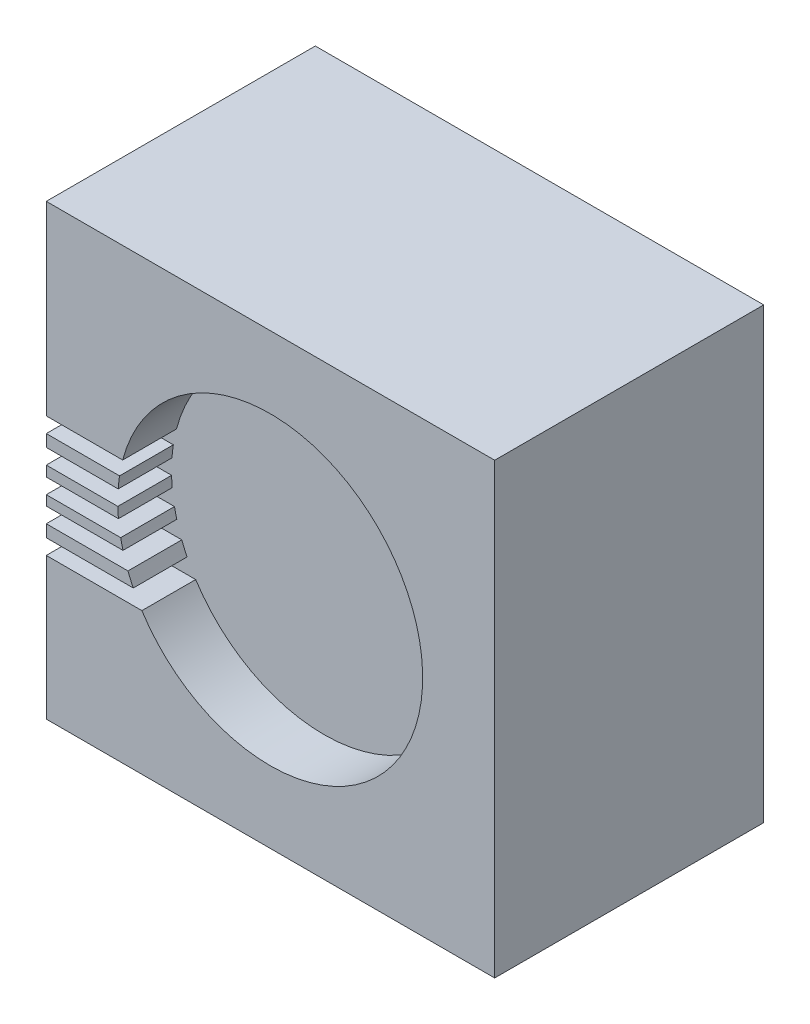
ISO-10303-21;
HEADER;
FILE_DESCRIPTION(('STEP AP214'),'2;1');
FILE_NAME('part.step','',(''),(''),'','','');
FILE_SCHEMA(('AUTOMOTIVE_DESIGN { 1 0 10303 214 1 1 1 1 }'));
ENDSEC;
DATA;
#1=APPLICATION_CONTEXT('core data for automotive mechanical design processes');
#2=APPLICATION_PROTOCOL_DEFINITION('international standard','automotive_design',2000,#1);
#3=PRODUCT_CONTEXT('',#1,'mechanical');
#4=PRODUCT('Part','Part','',(#3));
#5=PRODUCT_RELATED_PRODUCT_CATEGORY('part','',(#4));
#6=PRODUCT_DEFINITION_FORMATION('','',#4);
#7=PRODUCT_DEFINITION_CONTEXT('part definition',#1,'design');
#8=PRODUCT_DEFINITION('design','',#6,#7);
#9=PRODUCT_DEFINITION_SHAPE('','',#8);
#10=(LENGTH_UNIT() NAMED_UNIT(*) SI_UNIT(.MILLI.,.METRE.));
#11=(NAMED_UNIT(*) PLANE_ANGLE_UNIT() SI_UNIT($,.RADIAN.));
#12=(NAMED_UNIT(*) SI_UNIT($,.STERADIAN.) SOLID_ANGLE_UNIT());
#13=UNCERTAINTY_MEASURE_WITH_UNIT(LENGTH_MEASURE(1.E-05),#10,'distance_accuracy_value','');
#14=(GEOMETRIC_REPRESENTATION_CONTEXT(3) GLOBAL_UNCERTAINTY_ASSIGNED_CONTEXT((#13)) GLOBAL_UNIT_ASSIGNED_CONTEXT((#10,
#11,#12)) REPRESENTATION_CONTEXT('',''));
#15=CARTESIAN_POINT('',(0.,0.,0.));
#16=DIRECTION('',(0.,0.,1.));
#17=DIRECTION('',(1.,0.,0.));
#18=AXIS2_PLACEMENT_3D('',#15,#16,#17);
#19=CARTESIAN_POINT('',(-12.4853430800982,12.5073017444322,15.));
#20=DIRECTION('',(1.,0.,0.));
#21=DIRECTION('',(0.,1.,0.));
#22=AXIS2_PLACEMENT_3D('',#19,#20,#21);
#23=PLANE('',#22);
#24=DIRECTION('',(0.,0.,1.));
#25=VECTOR('',#24,1.);
#26=CARTESIAN_POINT('',(-12.4853430800982,1.29501387912612,15.));
#27=LINE('',#26,#25);
#28=CARTESIAN_POINT('',(-12.4853430800982,1.29501387912612,12.));
#29=VERTEX_POINT('',#28);
#30=CARTESIAN_POINT('',(-12.4853430800982,1.29501387912612,15.));
#31=VERTEX_POINT('',#30);
#32=EDGE_CURVE('E397',#29,#31,#27,.T.);
#33=ORIENTED_EDGE('',*,*,#32,.F.);
#34=DIRECTION('',(0.,-1.,0.));
#35=VECTOR('',#34,1.);
#36=CARTESIAN_POINT('',(-12.4853430800982,12.5073017444322,12.));
#37=LINE('',#36,#35);
#38=CARTESIAN_POINT('',(-12.4853430800982,2.14653217976772,12.));
#39=VERTEX_POINT('',#38);
#40=EDGE_CURVE('E12',#39,#29,#37,.T.);
#41=ORIENTED_EDGE('',*,*,#40,.F.);
#42=DIRECTION('',(0.,0.,1.));
#43=VECTOR('',#42,1.);
#44=CARTESIAN_POINT('',(-12.4853430800982,2.14653217976772,15.));
#45=LINE('',#44,#43);
#46=CARTESIAN_POINT('',(-12.4853430800982,2.14653217976772,15.));
#47=VERTEX_POINT('',#46);
#48=EDGE_CURVE('E304',#39,#47,#45,.T.);
#49=ORIENTED_EDGE('',*,*,#48,.T.);
#50=DIRECTION('',(0.,-1.,0.));
#51=VECTOR('',#50,1.);
#52=CARTESIAN_POINT('',(-12.4853430800982,12.5073017444322,15.));
#53=LINE('',#52,#51);
#54=CARTESIAN_POINT('',(-12.4853430800982,12.5073017444322,15.));
#55=VERTEX_POINT('',#54);
#56=EDGE_CURVE('E400',#55,#47,#53,.T.);
#57=ORIENTED_EDGE('',*,*,#56,.F.);
#58=DIRECTION('',(0.,0.,-1.));
#59=VECTOR('',#58,1.);
#60=CARTESIAN_POINT('',(-12.4853430800982,12.5073017444322,15.));
#61=LINE('',#60,#59);
#62=CARTESIAN_POINT('',(-12.4853430800982,12.5073017444322,0.));
#63=VERTEX_POINT('',#62);
#64=EDGE_CURVE('E408',#55,#63,#61,.T.);
#65=ORIENTED_EDGE('',*,*,#64,.T.);
#66=DIRECTION('',(0.,-1.,0.));
#67=VECTOR('',#66,1.);
#68=CARTESIAN_POINT('',(-12.4853430800982,12.5073017444322,0.));
#69=LINE('',#68,#67);
#70=CARTESIAN_POINT('',(-12.4853430800982,-12.4926982555678,0.));
#71=VERTEX_POINT('',#70);
#72=EDGE_CURVE('E399',#63,#71,#69,.T.);
#73=ORIENTED_EDGE('',*,*,#72,.T.);
#74=DIRECTION('',(0.,0.,-1.));
#75=VECTOR('',#74,1.);
#76=CARTESIAN_POINT('',(-12.4853430800982,-12.4926982555678,15.));
#77=LINE('',#76,#75);
#78=CARTESIAN_POINT('',(-12.4853430800982,-12.4926982555678,15.));
#79=VERTEX_POINT('',#78);
#80=EDGE_CURVE('E421',#79,#71,#77,.T.);
#81=ORIENTED_EDGE('',*,*,#80,.F.);
#82=CARTESIAN_POINT('',(-12.4853430800982,-4.58856910952185,15.));
#83=VERTEX_POINT('',#82);
#84=EDGE_CURVE('E160',#83,#79,#53,.T.);
#85=ORIENTED_EDGE('',*,*,#84,.F.);
#86=DIRECTION('',(0.,0.,1.));
#87=VECTOR('',#86,1.);
#88=CARTESIAN_POINT('',(-12.4853430800982,-4.58856910952185,15.));
#89=LINE('',#88,#87);
#90=CARTESIAN_POINT('',(-12.4853430800982,-4.58856910952185,12.));
#91=VERTEX_POINT('',#90);
#92=EDGE_CURVE('E379',#91,#83,#89,.T.);
#93=ORIENTED_EDGE('',*,*,#92,.F.);
#94=CARTESIAN_POINT('',(-12.4853430800982,-3.73705080888024,12.));
#95=VERTEX_POINT('',#94);
#96=EDGE_CURVE('E425',#95,#91,#37,.T.);
#97=ORIENTED_EDGE('',*,*,#96,.F.);
#98=DIRECTION('',(0.,0.,1.));
#99=VECTOR('',#98,1.);
#100=CARTESIAN_POINT('',(-12.4853430800982,-3.73705080888024,15.));
#101=LINE('',#100,#99);
#102=CARTESIAN_POINT('',(-12.4853430800982,-3.73705080888024,15.));
#103=VERTEX_POINT('',#102);
#104=EDGE_CURVE('E393',#95,#103,#101,.T.);
#105=ORIENTED_EDGE('',*,*,#104,.T.);
#106=CARTESIAN_POINT('',(-12.4853430800982,-3.05958451151475,15.));
#107=VERTEX_POINT('',#106);
#108=EDGE_CURVE('E444',#107,#103,#53,.T.);
#109=ORIENTED_EDGE('',*,*,#108,.F.);
#110=DIRECTION('',(0.,0.,1.));
#111=VECTOR('',#110,1.);
#112=CARTESIAN_POINT('',(-12.4853430800982,-3.05958451151475,15.));
#113=LINE('',#112,#111);
#114=CARTESIAN_POINT('',(-12.4853430800982,-3.05958451151475,12.));
#115=VERTEX_POINT('',#114);
#116=EDGE_CURVE('E391',#115,#107,#113,.T.);
#117=ORIENTED_EDGE('',*,*,#116,.F.);
#118=CARTESIAN_POINT('',(-12.4853430800982,-2.20806621087314,12.));
#119=VERTEX_POINT('',#118);
#120=EDGE_CURVE('E116',#119,#115,#37,.T.);
#121=ORIENTED_EDGE('',*,*,#120,.F.);
#122=DIRECTION('',(0.,0.,1.));
#123=VECTOR('',#122,1.);
#124=CARTESIAN_POINT('',(-12.4853430800982,-2.20806621087314,15.));
#125=LINE('',#124,#123);
#126=CARTESIAN_POINT('',(-12.4853430800982,-2.20806621087314,15.));
#127=VERTEX_POINT('',#126);
#128=EDGE_CURVE('E388',#119,#127,#125,.T.);
#129=ORIENTED_EDGE('',*,*,#128,.T.);
#130=CARTESIAN_POINT('',(-12.4853430800982,-1.65595407232962,15.));
#131=VERTEX_POINT('',#130);
#132=EDGE_CURVE('E447',#131,#127,#53,.T.);
#133=ORIENTED_EDGE('',*,*,#132,.F.);
#134=DIRECTION('',(0.,0.,1.));
#135=VECTOR('',#134,1.);
#136=CARTESIAN_POINT('',(-12.4853430800982,-1.65595407232962,15.));
#137=LINE('',#136,#135);
#138=CARTESIAN_POINT('',(-12.4853430800982,-1.65595407232962,12.));
#139=VERTEX_POINT('',#138);
#140=EDGE_CURVE('E386',#139,#131,#137,.T.);
#141=ORIENTED_EDGE('',*,*,#140,.F.);
#142=CARTESIAN_POINT('',(-12.4853430800982,-0.804435771688016,12.));
#143=VERTEX_POINT('',#142);
#144=EDGE_CURVE('E428',#143,#139,#37,.T.);
#145=ORIENTED_EDGE('',*,*,#144,.F.);
#146=DIRECTION('',(0.,0.,1.));
#147=VECTOR('',#146,1.);
#148=CARTESIAN_POINT('',(-12.4853430800982,-0.804435771688016,15.));
#149=LINE('',#148,#147);
#150=CARTESIAN_POINT('',(-12.4853430800982,-0.804435771688016,15.));
#151=VERTEX_POINT('',#150);
#152=EDGE_CURVE('E383',#143,#151,#149,.T.);
#153=ORIENTED_EDGE('',*,*,#152,.T.);
#154=CARTESIAN_POINT('',(-12.4853430800982,-0.226580522162923,15.));
#155=VERTEX_POINT('',#154);
#156=EDGE_CURVE('E449',#155,#151,#53,.T.);
#157=ORIENTED_EDGE('',*,*,#156,.F.);
#158=DIRECTION('',(0.,0.,1.));
#159=VECTOR('',#158,1.);
#160=CARTESIAN_POINT('',(-12.4853430800982,-0.226580522162923,15.));
#161=LINE('',#160,#159);
#162=CARTESIAN_POINT('',(-12.4853430800982,-0.226580522162923,12.));
#163=VERTEX_POINT('',#162);
#164=EDGE_CURVE('E381',#163,#155,#161,.T.);
#165=ORIENTED_EDGE('',*,*,#164,.F.);
#166=CARTESIAN_POINT('',(-12.4853430800982,0.624937778478685,12.));
#167=VERTEX_POINT('',#166);
#168=EDGE_CURVE('E111',#167,#163,#37,.T.);
#169=ORIENTED_EDGE('',*,*,#168,.F.);
#170=DIRECTION('',(0.,0.,1.));
#171=VECTOR('',#170,1.);
#172=CARTESIAN_POINT('',(-12.4853430800982,0.624937778478685,15.));
#173=LINE('',#172,#171);
#174=CARTESIAN_POINT('',(-12.4853430800982,0.624937778478685,15.));
#175=VERTEX_POINT('',#174);
#176=EDGE_CURVE('E376',#167,#175,#173,.T.);
#177=ORIENTED_EDGE('',*,*,#176,.T.);
#178=EDGE_CURVE('E403',#31,#175,#53,.T.);
#179=ORIENTED_EDGE('',*,*,#178,.F.);
#180=EDGE_LOOP('',(#33,#41,#49,#57,#65,#73,#81,#85,#93,#97,#105,#109,#117,#121,#129,#133,#141,
#145,#153,#157,#165,#169,#177,#179));
#181=FACE_BOUND('',#180,.T.);
#182=ADVANCED_FACE('F108',(#181),#23,.F.);
#183=CARTESIAN_POINT('',(0.,0.,15.));
#184=DIRECTION('',(0.,0.,1.));
#185=DIRECTION('',(1.,0.,0.));
#186=AXIS2_PLACEMENT_3D('',#183,#184,#185);
#187=PLANE('',#186);
#188=DIRECTION('',(-1.,0.,0.));
#189=VECTOR('',#188,1.);
#190=CARTESIAN_POINT('',(-8.22449996055819,2.14653217976772,15.));
#191=LINE('',#190,#189);
#192=CARTESIAN_POINT('',(-8.22449996055819,2.14653217976772,15.));
#193=VERTEX_POINT('',#192);
#194=EDGE_CURVE('E308',#193,#47,#191,.T.);
#195=ORIENTED_EDGE('',*,*,#194,.F.);
#196=CARTESIAN_POINT('',(0.,0.,15.));
#197=DIRECTION('',(0.,0.,1.));
#198=DIRECTION('',(1.,0.,0.));
#199=AXIS2_PLACEMENT_3D('',#196,#197,#198);
#200=CIRCLE('',#199,8.5);
#201=CARTESIAN_POINT('',(-7.15507047674178,-4.58856910952185,15.));
#202=VERTEX_POINT('',#201);
#203=EDGE_CURVE('E284',#202,#193,#200,.T.);
#204=ORIENTED_EDGE('',*,*,#203,.F.);
#205=DIRECTION('',(-1.,0.,0.));
#206=VECTOR('',#205,1.);
#207=CARTESIAN_POINT('',(-7.10762675444698,-4.58856910952185,15.));
#208=LINE('',#207,#206);
#209=EDGE_CURVE('E355',#202,#83,#208,.T.);
#210=ORIENTED_EDGE('',*,*,#209,.T.);
#211=ORIENTED_EDGE('',*,*,#84,.T.);
#212=DIRECTION('',(1.,0.,0.));
#213=VECTOR('',#212,1.);
#214=CARTESIAN_POINT('',(-12.4853430800982,-12.4926982555678,15.));
#215=LINE('',#214,#213);
#216=CARTESIAN_POINT('',(12.5146569199018,-12.4926982555678,15.));
#217=VERTEX_POINT('',#216);
#218=EDGE_CURVE('E402',#79,#217,#215,.T.);
#219=ORIENTED_EDGE('',*,*,#218,.T.);
#220=DIRECTION('',(0.,1.,0.));
#221=VECTOR('',#220,1.);
#222=CARTESIAN_POINT('',(12.5146569199018,12.5073017444322,15.));
#223=LINE('',#222,#221);
#224=CARTESIAN_POINT('',(12.5146569199018,12.5073017444322,15.));
#225=VERTEX_POINT('',#224);
#226=EDGE_CURVE('E405',#217,#225,#223,.T.);
#227=ORIENTED_EDGE('',*,*,#226,.T.);
#228=DIRECTION('',(-1.,0.,0.));
#229=VECTOR('',#228,1.);
#230=CARTESIAN_POINT('',(-12.4853430800982,12.5073017444322,15.));
#231=LINE('',#230,#229);
#232=EDGE_CURVE('E132',#225,#55,#231,.T.);
#233=ORIENTED_EDGE('',*,*,#232,.T.);
#234=ORIENTED_EDGE('',*,*,#56,.T.);
#235=EDGE_LOOP('',(#195,#204,#210,#211,#219,#227,#233,#234));
#236=FACE_BOUND('',#235,.T.);
#237=ADVANCED_FACE('F491',(#236),#187,.T.);
#238=DIRECTION('',(-1.,0.,0.));
#239=VECTOR('',#238,1.);
#240=CARTESIAN_POINT('',(-7.10762675444698,-3.73705080888024,15.));
#241=LINE('',#240,#239);
#242=CARTESIAN_POINT('',(-7.63442540417074,-3.73705080888024,15.));
#243=VERTEX_POINT('',#242);
#244=EDGE_CURVE('E298',#243,#103,#241,.T.);
#245=ORIENTED_EDGE('',*,*,#244,.F.);
#246=CARTESIAN_POINT('',(-7.93025488978123,-3.05958451151475,15.));
#247=VERTEX_POINT('',#246);
#248=EDGE_CURVE('E362',#247,#243,#200,.T.);
#249=ORIENTED_EDGE('',*,*,#248,.F.);
#250=DIRECTION('',(-1.,0.,0.));
#251=VECTOR('',#250,1.);
#252=CARTESIAN_POINT('',(-7.85123348813954,-3.05958451151475,15.));
#253=LINE('',#252,#251);
#254=EDGE_CURVE('E343',#247,#107,#253,.T.);
#255=ORIENTED_EDGE('',*,*,#254,.T.);
#256=ORIENTED_EDGE('',*,*,#108,.T.);
#257=EDGE_LOOP('',(#245,#249,#255,#256));
#258=FACE_BOUND('',#257,.T.);
#259=ADVANCED_FACE('F488',(#258),#187,.T.);
#260=DIRECTION('',(-1.,0.,0.));
#261=VECTOR('',#260,1.);
#262=CARTESIAN_POINT('',(-7.85123348813954,-2.20806621087314,15.));
#263=LINE('',#262,#261);
#264=CARTESIAN_POINT('',(-8.20819368731028,-2.20806621087314,15.));
#265=VERTEX_POINT('',#264);
#266=EDGE_CURVE('E347',#265,#127,#263,.T.);
#267=ORIENTED_EDGE('',*,*,#266,.F.);
#268=CARTESIAN_POINT('',(-8.33713476623324,-1.65595407232962,15.));
#269=VERTEX_POINT('',#268);
#270=EDGE_CURVE('E474',#269,#265,#200,.T.);
#271=ORIENTED_EDGE('',*,*,#270,.F.);
#272=DIRECTION('',(-1.,0.,0.));
#273=VECTOR('',#272,1.);
#274=CARTESIAN_POINT('',(-8.21362970197015,-1.65595407232962,15.));
#275=LINE('',#274,#273);
#276=EDGE_CURVE('E330',#269,#131,#275,.T.);
#277=ORIENTED_EDGE('',*,*,#276,.T.);
#278=ORIENTED_EDGE('',*,*,#132,.T.);
#279=EDGE_LOOP('',(#267,#271,#277,#278));
#280=FACE_BOUND('',#279,.T.);
#281=ADVANCED_FACE('F490',(#280),#187,.T.);
#282=CARTESIAN_POINT('',(-8.40077014641341,1.29501387912612,15.));
#283=VERTEX_POINT('',#282);
#284=CARTESIAN_POINT('',(-8.47699550389347,0.624937778478685,15.));
#285=VERTEX_POINT('',#284);
#286=EDGE_CURVE('E361',#283,#285,#200,.T.);
#287=ORIENTED_EDGE('',*,*,#286,.F.);
#288=DIRECTION('',(-1.,0.,0.));
#289=VECTOR('',#288,1.);
#290=CARTESIAN_POINT('',(-8.22449996055819,1.29501387912612,15.));
#291=LINE('',#290,#289);
#292=EDGE_CURVE('E123',#283,#31,#291,.T.);
#293=ORIENTED_EDGE('',*,*,#292,.T.);
#294=ORIENTED_EDGE('',*,*,#178,.T.);
#295=DIRECTION('',(-1.,0.,0.));
#296=VECTOR('',#295,1.);
#297=CARTESIAN_POINT('',(-8.25389594794501,0.624937778478685,15.));
#298=LINE('',#297,#296);
#299=EDGE_CURVE('E321',#285,#175,#298,.T.);
#300=ORIENTED_EDGE('',*,*,#299,.F.);
#301=EDGE_LOOP('',(#287,#293,#294,#300));
#302=FACE_BOUND('',#301,.T.);
#303=ADVANCED_FACE('F462',(#302),#187,.T.);
#304=CARTESIAN_POINT('',(-12.4853430800982,-12.4926982555678,15.));
#305=DIRECTION('',(0.,1.,0.));
#306=DIRECTION('',(0.,0.,1.));
#307=AXIS2_PLACEMENT_3D('',#304,#305,#306);
#308=PLANE('',#307);
#309=DIRECTION('',(1.,0.,0.));
#310=VECTOR('',#309,1.);
#311=CARTESIAN_POINT('',(-12.4853430800982,-12.4926982555678,0.));
#312=LINE('',#311,#310);
#313=CARTESIAN_POINT('',(12.5146569199018,-12.4926982555678,0.));
#314=VERTEX_POINT('',#313);
#315=EDGE_CURVE('E411',#71,#314,#312,.T.);
#316=ORIENTED_EDGE('',*,*,#315,.T.);
#317=DIRECTION('',(0.,0.,-1.));
#318=VECTOR('',#317,1.);
#319=CARTESIAN_POINT('',(12.5146569199018,-12.4926982555678,15.));
#320=LINE('',#319,#318);
#321=EDGE_CURVE('E419',#217,#314,#320,.T.);
#322=ORIENTED_EDGE('',*,*,#321,.F.);
#323=ORIENTED_EDGE('',*,*,#218,.F.);
#324=ORIENTED_EDGE('',*,*,#80,.T.);
#325=EDGE_LOOP('',(#316,#322,#323,#324));
#326=FACE_BOUND('',#325,.T.);
#327=ADVANCED_FACE('F527',(#326),#308,.F.);
#328=CARTESIAN_POINT('',(12.5146569199018,12.5073017444322,15.));
#329=DIRECTION('',(-1.,0.,0.));
#330=DIRECTION('',(0.,-1.,0.));
#331=AXIS2_PLACEMENT_3D('',#328,#329,#330);
#332=PLANE('',#331);
#333=DIRECTION('',(0.,1.,0.));
#334=VECTOR('',#333,1.);
#335=CARTESIAN_POINT('',(12.5146569199018,12.5073017444322,0.));
#336=LINE('',#335,#334);
#337=CARTESIAN_POINT('',(12.5146569199018,12.5073017444322,0.));
#338=VERTEX_POINT('',#337);
#339=EDGE_CURVE('E413',#314,#338,#336,.T.);
#340=ORIENTED_EDGE('',*,*,#339,.T.);
#341=DIRECTION('',(0.,0.,-1.));
#342=VECTOR('',#341,1.);
#343=CARTESIAN_POINT('',(12.5146569199018,12.5073017444322,15.));
#344=LINE('',#343,#342);
#345=EDGE_CURVE('E417',#225,#338,#344,.T.);
#346=ORIENTED_EDGE('',*,*,#345,.F.);
#347=ORIENTED_EDGE('',*,*,#226,.F.);
#348=ORIENTED_EDGE('',*,*,#321,.T.);
#349=EDGE_LOOP('',(#340,#346,#347,#348));
#350=FACE_BOUND('',#349,.T.);
#351=ADVANCED_FACE('F696',(#350),#332,.F.);
#352=CARTESIAN_POINT('',(-12.4853430800982,12.5073017444322,15.));
#353=DIRECTION('',(0.,-1.,0.));
#354=DIRECTION('',(0.,0.,-1.));
#355=AXIS2_PLACEMENT_3D('',#352,#353,#354);
#356=PLANE('',#355);
#357=DIRECTION('',(-1.,0.,0.));
#358=VECTOR('',#357,1.);
#359=CARTESIAN_POINT('',(-12.4853430800982,12.5073017444322,0.));
#360=LINE('',#359,#358);
#361=EDGE_CURVE('E153',#338,#63,#360,.T.);
#362=ORIENTED_EDGE('',*,*,#361,.T.);
#363=ORIENTED_EDGE('',*,*,#64,.F.);
#364=ORIENTED_EDGE('',*,*,#232,.F.);
#365=ORIENTED_EDGE('',*,*,#345,.T.);
#366=EDGE_LOOP('',(#362,#363,#364,#365));
#367=FACE_BOUND('',#366,.T.);
#368=ADVANCED_FACE('F538',(#367),#356,.F.);
#369=DIRECTION('',(-1.,0.,0.));
#370=VECTOR('',#369,1.);
#371=CARTESIAN_POINT('',(-8.21362970197015,-0.804435771688016,15.));
#372=LINE('',#371,#370);
#373=CARTESIAN_POINT('',(-8.46184868035518,-0.804435771688016,15.));
#374=VERTEX_POINT('',#373);
#375=EDGE_CURVE('E334',#374,#151,#372,.T.);
#376=ORIENTED_EDGE('',*,*,#375,.F.);
#377=CARTESIAN_POINT('',(-8.4969795378697,-0.226580522162923,15.));
#378=VERTEX_POINT('',#377);
#379=EDGE_CURVE('E473',#378,#374,#200,.T.);
#380=ORIENTED_EDGE('',*,*,#379,.F.);
#381=DIRECTION('',(-1.,0.,0.));
#382=VECTOR('',#381,1.);
#383=CARTESIAN_POINT('',(-8.25389594794501,-0.226580522162923,15.));
#384=LINE('',#383,#382);
#385=EDGE_CURVE('E317',#378,#155,#384,.T.);
#386=ORIENTED_EDGE('',*,*,#385,.T.);
#387=ORIENTED_EDGE('',*,*,#156,.T.);
#388=EDGE_LOOP('',(#376,#380,#386,#387));
#389=FACE_BOUND('',#388,.T.);
#390=ADVANCED_FACE('F497',(#389),#187,.T.);
#391=CARTESIAN_POINT('',(0.,0.,0.));
#392=DIRECTION('',(0.,0.,1.));
#393=DIRECTION('',(1.,0.,0.));
#394=AXIS2_PLACEMENT_3D('',#391,#392,#393);
#395=PLANE('',#394);
#396=ORIENTED_EDGE('',*,*,#72,.F.);
#397=ORIENTED_EDGE('',*,*,#361,.F.);
#398=ORIENTED_EDGE('',*,*,#339,.F.);
#399=ORIENTED_EDGE('',*,*,#315,.F.);
#400=EDGE_LOOP('',(#396,#397,#398,#399));
#401=FACE_BOUND('',#400,.T.);
#402=ADVANCED_FACE('F537',(#401),#395,.F.);
#403=CARTESIAN_POINT('',(0.,0.,12.));
#404=DIRECTION('',(0.,0.,1.));
#405=DIRECTION('',(1.,0.,0.));
#406=AXIS2_PLACEMENT_3D('',#403,#404,#405);
#407=PLANE('',#406);
#408=ORIENTED_EDGE('',*,*,#40,.T.);
#409=DIRECTION('',(-1.,0.,0.));
#410=VECTOR('',#409,1.);
#411=CARTESIAN_POINT('',(-8.22449996055819,1.29501387912612,12.));
#412=LINE('',#411,#410);
#413=CARTESIAN_POINT('',(-8.40077014641341,1.29501387912612,12.));
#414=VERTEX_POINT('',#413);
#415=EDGE_CURVE('E289',#414,#29,#412,.T.);
#416=ORIENTED_EDGE('',*,*,#415,.F.);
#417=CARTESIAN_POINT('',(0.,0.,12.));
#418=DIRECTION('',(0.,0.,1.));
#419=DIRECTION('',(1.,0.,0.));
#420=AXIS2_PLACEMENT_3D('',#417,#418,#419);
#421=CIRCLE('',#420,8.5);
#422=CARTESIAN_POINT('',(-8.47699550389347,0.624937778478685,12.));
#423=VERTEX_POINT('',#422);
#424=EDGE_CURVE('E299',#414,#423,#421,.T.);
#425=ORIENTED_EDGE('',*,*,#424,.T.);
#426=DIRECTION('',(-1.,0.,0.));
#427=VECTOR('',#426,1.);
#428=CARTESIAN_POINT('',(-8.25389594794501,0.624937778478685,12.));
#429=LINE('',#428,#427);
#430=EDGE_CURVE('E313',#423,#167,#429,.T.);
#431=ORIENTED_EDGE('',*,*,#430,.T.);
#432=ORIENTED_EDGE('',*,*,#168,.T.);
#433=DIRECTION('',(-1.,0.,0.));
#434=VECTOR('',#433,1.);
#435=CARTESIAN_POINT('',(-8.25389594794501,-0.226580522162923,12.));
#436=LINE('',#435,#434);
#437=CARTESIAN_POINT('',(-8.4969795378697,-0.226580522162923,12.));
#438=VERTEX_POINT('',#437);
#439=EDGE_CURVE('E316',#438,#163,#436,.T.);
#440=ORIENTED_EDGE('',*,*,#439,.F.);
#441=CARTESIAN_POINT('',(-8.46184868035518,-0.804435771688016,12.));
#442=VERTEX_POINT('',#441);
#443=EDGE_CURVE('E471',#438,#442,#421,.T.);
#444=ORIENTED_EDGE('',*,*,#443,.T.);
#445=DIRECTION('',(-1.,0.,0.));
#446=VECTOR('',#445,1.);
#447=CARTESIAN_POINT('',(-8.21362970197015,-0.804435771688016,12.));
#448=LINE('',#447,#446);
#449=EDGE_CURVE('E326',#442,#143,#448,.T.);
#450=ORIENTED_EDGE('',*,*,#449,.T.);
#451=ORIENTED_EDGE('',*,*,#144,.T.);
#452=DIRECTION('',(-1.,0.,0.));
#453=VECTOR('',#452,1.);
#454=CARTESIAN_POINT('',(-8.21362970197015,-1.65595407232962,12.));
#455=LINE('',#454,#453);
#456=CARTESIAN_POINT('',(-8.33713476623324,-1.65595407232962,12.));
#457=VERTEX_POINT('',#456);
#458=EDGE_CURVE('E329',#457,#139,#455,.T.);
#459=ORIENTED_EDGE('',*,*,#458,.F.);
#460=CARTESIAN_POINT('',(-8.20819368731028,-2.20806621087314,12.));
#461=VERTEX_POINT('',#460);
#462=EDGE_CURVE('E686',#457,#461,#421,.T.);
#463=ORIENTED_EDGE('',*,*,#462,.T.);
#464=DIRECTION('',(-1.,0.,0.));
#465=VECTOR('',#464,1.);
#466=CARTESIAN_POINT('',(-7.85123348813954,-2.20806621087314,12.));
#467=LINE('',#466,#465);
#468=EDGE_CURVE('E339',#461,#119,#467,.T.);
#469=ORIENTED_EDGE('',*,*,#468,.T.);
#470=ORIENTED_EDGE('',*,*,#120,.T.);
#471=DIRECTION('',(-1.,0.,0.));
#472=VECTOR('',#471,1.);
#473=CARTESIAN_POINT('',(-7.85123348813954,-3.05958451151475,12.));
#474=LINE('',#473,#472);
#475=CARTESIAN_POINT('',(-7.93025488978123,-3.05958451151475,12.));
#476=VERTEX_POINT('',#475);
#477=EDGE_CURVE('E342',#476,#115,#474,.T.);
#478=ORIENTED_EDGE('',*,*,#477,.F.);
#479=CARTESIAN_POINT('',(-7.63442540417074,-3.73705080888024,12.));
#480=VERTEX_POINT('',#479);
#481=EDGE_CURVE('E301',#476,#480,#421,.T.);
#482=ORIENTED_EDGE('',*,*,#481,.T.);
#483=DIRECTION('',(-1.,0.,0.));
#484=VECTOR('',#483,1.);
#485=CARTESIAN_POINT('',(-7.10762675444698,-3.73705080888024,12.));
#486=LINE('',#485,#484);
#487=EDGE_CURVE('E352',#480,#95,#486,.T.);
#488=ORIENTED_EDGE('',*,*,#487,.T.);
#489=ORIENTED_EDGE('',*,*,#96,.T.);
#490=DIRECTION('',(-1.,0.,0.));
#491=VECTOR('',#490,1.);
#492=CARTESIAN_POINT('',(-7.10762675444698,-4.58856910952185,12.));
#493=LINE('',#492,#491);
#494=CARTESIAN_POINT('',(-7.15507047674178,-4.58856910952185,12.));
#495=VERTEX_POINT('',#494);
#496=EDGE_CURVE('E297',#495,#91,#493,.T.);
#497=ORIENTED_EDGE('',*,*,#496,.F.);
#498=CARTESIAN_POINT('',(-8.22449996055819,2.14653217976772,12.));
#499=VERTEX_POINT('',#498);
#500=EDGE_CURVE('E281',#495,#499,#421,.T.);
#501=ORIENTED_EDGE('',*,*,#500,.T.);
#502=DIRECTION('',(-1.,0.,0.));
#503=VECTOR('',#502,1.);
#504=CARTESIAN_POINT('',(-8.22449996055819,2.14653217976772,12.));
#505=LINE('',#504,#503);
#506=EDGE_CURVE('E294',#499,#39,#505,.T.);
#507=ORIENTED_EDGE('',*,*,#506,.T.);
#508=EDGE_LOOP('',(#408,#416,#425,#431,#432,#440,#444,#450,#451,#459,#463,#469,#470,#478,#482,
#488,#489,#497,#501,#507));
#509=FACE_BOUND('',#508,.T.);
#510=ADVANCED_FACE('F293',(#509),#407,.T.);
#511=CARTESIAN_POINT('',(-8.22449996055819,1.29501387912612,12.));
#512=DIRECTION('',(0.,1.,0.));
#513=DIRECTION('',(0.,0.,1.));
#514=AXIS2_PLACEMENT_3D('',#511,#512,#513);
#515=PLANE('',#514);
#516=ORIENTED_EDGE('',*,*,#32,.T.);
#517=ORIENTED_EDGE('',*,*,#292,.F.);
#518=DIRECTION('',(0.,0.,1.));
#519=VECTOR('',#518,1.);
#520=CARTESIAN_POINT('',(-8.40077014641341,1.29501387912612,12.));
#521=LINE('',#520,#519);
#522=EDGE_CURVE('E288',#414,#283,#521,.T.);
#523=ORIENTED_EDGE('',*,*,#522,.F.);
#524=ORIENTED_EDGE('',*,*,#415,.T.);
#525=EDGE_LOOP('',(#516,#517,#523,#524));
#526=FACE_BOUND('',#525,.T.);
#527=ADVANCED_FACE('F549',(#526),#515,.T.);
#528=CARTESIAN_POINT('',(-8.22449996055819,2.14653217976772,12.));
#529=DIRECTION('',(0.,1.,0.));
#530=DIRECTION('',(0.,0.,1.));
#531=AXIS2_PLACEMENT_3D('',#528,#529,#530);
#532=PLANE('',#531);
#533=ORIENTED_EDGE('',*,*,#506,.F.);
#534=DIRECTION('',(0.,0.,1.));
#535=VECTOR('',#534,1.);
#536=CARTESIAN_POINT('',(-8.22449996055819,2.14653217976772,12.));
#537=LINE('',#536,#535);
#538=EDGE_CURVE('E278',#499,#193,#537,.T.);
#539=ORIENTED_EDGE('',*,*,#538,.T.);
#540=ORIENTED_EDGE('',*,*,#194,.T.);
#541=ORIENTED_EDGE('',*,*,#48,.F.);
#542=EDGE_LOOP('',(#533,#539,#540,#541));
#543=FACE_BOUND('',#542,.T.);
#544=ADVANCED_FACE('F302',(#543),#532,.F.);
#545=CARTESIAN_POINT('',(-7.10762675444698,-3.73705080888024,12.));
#546=DIRECTION('',(0.,1.,0.));
#547=DIRECTION('',(0.,0.,1.));
#548=AXIS2_PLACEMENT_3D('',#545,#546,#547);
#549=PLANE('',#548);
#550=ORIENTED_EDGE('',*,*,#487,.F.);
#551=DIRECTION('',(0.,0.,1.));
#552=VECTOR('',#551,1.);
#553=CARTESIAN_POINT('',(-7.63442540417074,-3.73705080888024,12.));
#554=LINE('',#553,#552);
#555=EDGE_CURVE('E349',#480,#243,#554,.T.);
#556=ORIENTED_EDGE('',*,*,#555,.T.);
#557=ORIENTED_EDGE('',*,*,#244,.T.);
#558=ORIENTED_EDGE('',*,*,#104,.F.);
#559=EDGE_LOOP('',(#550,#556,#557,#558));
#560=FACE_BOUND('',#559,.T.);
#561=ADVANCED_FACE('F487',(#560),#549,.F.);
#562=CARTESIAN_POINT('',(-7.85123348813954,-3.05958451151475,12.));
#563=DIRECTION('',(0.,1.,0.));
#564=DIRECTION('',(0.,0.,1.));
#565=AXIS2_PLACEMENT_3D('',#562,#563,#564);
#566=PLANE('',#565);
#567=ORIENTED_EDGE('',*,*,#116,.T.);
#568=ORIENTED_EDGE('',*,*,#254,.F.);
#569=DIRECTION('',(0.,0.,1.));
#570=VECTOR('',#569,1.);
#571=CARTESIAN_POINT('',(-7.93025488978123,-3.05958451151475,12.));
#572=LINE('',#571,#570);
#573=EDGE_CURVE('E346',#476,#247,#572,.T.);
#574=ORIENTED_EDGE('',*,*,#573,.F.);
#575=ORIENTED_EDGE('',*,*,#477,.T.);
#576=EDGE_LOOP('',(#567,#568,#574,#575));
#577=FACE_BOUND('',#576,.T.);
#578=ADVANCED_FACE('F438',(#577),#566,.T.);
#579=CARTESIAN_POINT('',(-7.85123348813954,-2.20806621087314,12.));
#580=DIRECTION('',(0.,1.,0.));
#581=DIRECTION('',(0.,0.,1.));
#582=AXIS2_PLACEMENT_3D('',#579,#580,#581);
#583=PLANE('',#582);
#584=ORIENTED_EDGE('',*,*,#468,.F.);
#585=DIRECTION('',(0.,0.,1.));
#586=VECTOR('',#585,1.);
#587=CARTESIAN_POINT('',(-8.20819368731028,-2.20806621087314,12.));
#588=LINE('',#587,#586);
#589=EDGE_CURVE('E336',#461,#265,#588,.T.);
#590=ORIENTED_EDGE('',*,*,#589,.T.);
#591=ORIENTED_EDGE('',*,*,#266,.T.);
#592=ORIENTED_EDGE('',*,*,#128,.F.);
#593=EDGE_LOOP('',(#584,#590,#591,#592));
#594=FACE_BOUND('',#593,.T.);
#595=ADVANCED_FACE('F582',(#594),#583,.F.);
#596=CARTESIAN_POINT('',(-8.21362970197015,-1.65595407232962,12.));
#597=DIRECTION('',(0.,1.,0.));
#598=DIRECTION('',(0.,0.,1.));
#599=AXIS2_PLACEMENT_3D('',#596,#597,#598);
#600=PLANE('',#599);
#601=ORIENTED_EDGE('',*,*,#140,.T.);
#602=ORIENTED_EDGE('',*,*,#276,.F.);
#603=DIRECTION('',(0.,0.,1.));
#604=VECTOR('',#603,1.);
#605=CARTESIAN_POINT('',(-8.33713476623324,-1.65595407232962,12.));
#606=LINE('',#605,#604);
#607=EDGE_CURVE('E333',#457,#269,#606,.T.);
#608=ORIENTED_EDGE('',*,*,#607,.F.);
#609=ORIENTED_EDGE('',*,*,#458,.T.);
#610=EDGE_LOOP('',(#601,#602,#608,#609));
#611=FACE_BOUND('',#610,.T.);
#612=ADVANCED_FACE('F591',(#611),#600,.T.);
#613=CARTESIAN_POINT('',(-8.21362970197015,-0.804435771688016,12.));
#614=DIRECTION('',(0.,1.,0.));
#615=DIRECTION('',(0.,0.,1.));
#616=AXIS2_PLACEMENT_3D('',#613,#614,#615);
#617=PLANE('',#616);
#618=ORIENTED_EDGE('',*,*,#449,.F.);
#619=DIRECTION('',(0.,0.,1.));
#620=VECTOR('',#619,1.);
#621=CARTESIAN_POINT('',(-8.46184868035518,-0.804435771688016,12.));
#622=LINE('',#621,#620);
#623=EDGE_CURVE('E323',#442,#374,#622,.T.);
#624=ORIENTED_EDGE('',*,*,#623,.T.);
#625=ORIENTED_EDGE('',*,*,#375,.T.);
#626=ORIENTED_EDGE('',*,*,#152,.F.);
#627=EDGE_LOOP('',(#618,#624,#625,#626));
#628=FACE_BOUND('',#627,.T.);
#629=ADVANCED_FACE('F601',(#628),#617,.F.);
#630=CARTESIAN_POINT('',(-8.25389594794501,-0.226580522162923,12.));
#631=DIRECTION('',(0.,1.,0.));
#632=DIRECTION('',(0.,0.,1.));
#633=AXIS2_PLACEMENT_3D('',#630,#631,#632);
#634=PLANE('',#633);
#635=ORIENTED_EDGE('',*,*,#164,.T.);
#636=ORIENTED_EDGE('',*,*,#385,.F.);
#637=DIRECTION('',(0.,0.,1.));
#638=VECTOR('',#637,1.);
#639=CARTESIAN_POINT('',(-8.4969795378697,-0.226580522162923,12.));
#640=LINE('',#639,#638);
#641=EDGE_CURVE('E320',#438,#378,#640,.T.);
#642=ORIENTED_EDGE('',*,*,#641,.F.);
#643=ORIENTED_EDGE('',*,*,#439,.T.);
#644=EDGE_LOOP('',(#635,#636,#642,#643));
#645=FACE_BOUND('',#644,.T.);
#646=ADVANCED_FACE('F611',(#645),#634,.T.);
#647=CARTESIAN_POINT('',(-7.10762675444698,-4.58856910952185,12.));
#648=DIRECTION('',(0.,1.,0.));
#649=DIRECTION('',(0.,0.,1.));
#650=AXIS2_PLACEMENT_3D('',#647,#648,#649);
#651=PLANE('',#650);
#652=ORIENTED_EDGE('',*,*,#92,.T.);
#653=ORIENTED_EDGE('',*,*,#209,.F.);
#654=DIRECTION('',(0.,0.,1.));
#655=VECTOR('',#654,1.);
#656=CARTESIAN_POINT('',(-7.15507047674178,-4.58856910952185,12.));
#657=LINE('',#656,#655);
#658=EDGE_CURVE('E357',#495,#202,#657,.T.);
#659=ORIENTED_EDGE('',*,*,#658,.F.);
#660=ORIENTED_EDGE('',*,*,#496,.T.);
#661=EDGE_LOOP('',(#652,#653,#659,#660));
#662=FACE_BOUND('',#661,.T.);
#663=ADVANCED_FACE('F621',(#662),#651,.T.);
#664=CARTESIAN_POINT('',(-8.25389594794501,0.624937778478685,12.));
#665=DIRECTION('',(0.,1.,0.));
#666=DIRECTION('',(0.,0.,1.));
#667=AXIS2_PLACEMENT_3D('',#664,#665,#666);
#668=PLANE('',#667);
#669=ORIENTED_EDGE('',*,*,#430,.F.);
#670=DIRECTION('',(0.,0.,1.));
#671=VECTOR('',#670,1.);
#672=CARTESIAN_POINT('',(-8.47699550389347,0.624937778478685,12.));
#673=LINE('',#672,#671);
#674=EDGE_CURVE('E311',#423,#285,#673,.T.);
#675=ORIENTED_EDGE('',*,*,#674,.T.);
#676=ORIENTED_EDGE('',*,*,#299,.T.);
#677=ORIENTED_EDGE('',*,*,#176,.F.);
#678=EDGE_LOOP('',(#669,#675,#676,#677));
#679=FACE_BOUND('',#678,.T.);
#680=ADVANCED_FACE('F466',(#679),#668,.F.);
#681=CARTESIAN_POINT('',(0.,0.,12.));
#682=DIRECTION('',(0.,0.,1.));
#683=DIRECTION('',(1.,0.,0.));
#684=AXIS2_PLACEMENT_3D('',#681,#682,#683);
#685=CYLINDRICAL_SURFACE('',#684,8.5);
#686=ORIENTED_EDGE('',*,*,#538,.F.);
#687=ORIENTED_EDGE('',*,*,#500,.F.);
#688=ORIENTED_EDGE('',*,*,#658,.T.);
#689=ORIENTED_EDGE('',*,*,#203,.T.);
#690=EDGE_LOOP('',(#686,#687,#688,#689));
#691=FACE_BOUND('',#690,.T.);
#692=ADVANCED_FACE('F280',(#691),#685,.F.);
#693=ORIENTED_EDGE('',*,*,#573,.T.);
#694=ORIENTED_EDGE('',*,*,#248,.T.);
#695=ORIENTED_EDGE('',*,*,#555,.F.);
#696=ORIENTED_EDGE('',*,*,#481,.F.);
#697=EDGE_LOOP('',(#693,#694,#695,#696));
#698=FACE_BOUND('',#697,.T.);
#699=ADVANCED_FACE('F484',(#698),#685,.F.);
#700=ORIENTED_EDGE('',*,*,#607,.T.);
#701=ORIENTED_EDGE('',*,*,#270,.T.);
#702=ORIENTED_EDGE('',*,*,#589,.F.);
#703=ORIENTED_EDGE('',*,*,#462,.F.);
#704=EDGE_LOOP('',(#700,#701,#702,#703));
#705=FACE_BOUND('',#704,.T.);
#706=ADVANCED_FACE('F655',(#705),#685,.F.);
#707=ORIENTED_EDGE('',*,*,#641,.T.);
#708=ORIENTED_EDGE('',*,*,#379,.T.);
#709=ORIENTED_EDGE('',*,*,#623,.F.);
#710=ORIENTED_EDGE('',*,*,#443,.F.);
#711=EDGE_LOOP('',(#707,#708,#709,#710));
#712=FACE_BOUND('',#711,.T.);
#713=ADVANCED_FACE('F663',(#712),#685,.F.);
#714=ORIENTED_EDGE('',*,*,#522,.T.);
#715=ORIENTED_EDGE('',*,*,#286,.T.);
#716=ORIENTED_EDGE('',*,*,#674,.F.);
#717=ORIENTED_EDGE('',*,*,#424,.F.);
#718=EDGE_LOOP('',(#714,#715,#716,#717));
#719=FACE_BOUND('',#718,.T.);
#720=ADVANCED_FACE('F472',(#719),#685,.F.);
#721=CLOSED_SHELL('',(#182,#237,#259,#281,#303,#327,#351,#368,#390,#402,#510,#527,#544,#561,
#578,#595,#612,#629,#646,#663,#680,#692,#699,#706,#713,#720));
#722=MANIFOLD_SOLID_BREP('B2',#721);
#723=ADVANCED_BREP_SHAPE_REPRESENTATION('',(#18,#722),#14);
#724=SHAPE_DEFINITION_REPRESENTATION(#9,#723);
ENDSEC;
END-ISO-10303-21;
